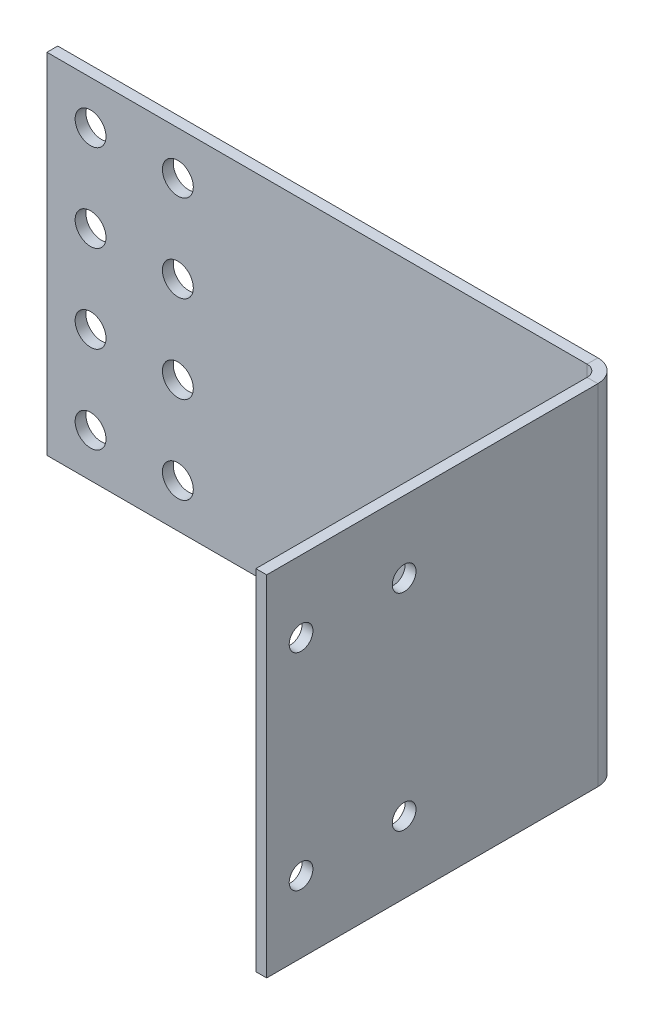
ISO-10303-21;
HEADER;
FILE_DESCRIPTION(('STEP AP214'),'2;1');
FILE_NAME('part.step','',(''),(''),'','','');
FILE_SCHEMA(('AUTOMOTIVE_DESIGN { 1 0 10303 214 1 1 1 1 }'));
ENDSEC;
DATA;
#1=APPLICATION_CONTEXT('core data for automotive mechanical design processes');
#2=APPLICATION_PROTOCOL_DEFINITION('international standard','automotive_design',2000,#1);
#3=PRODUCT_CONTEXT('',#1,'mechanical');
#4=PRODUCT('Part','Part','',(#3));
#5=PRODUCT_RELATED_PRODUCT_CATEGORY('part','',(#4));
#6=PRODUCT_DEFINITION_FORMATION('','',#4);
#7=PRODUCT_DEFINITION_CONTEXT('part definition',#1,'design');
#8=PRODUCT_DEFINITION('design','',#6,#7);
#9=PRODUCT_DEFINITION_SHAPE('','',#8);
#10=(LENGTH_UNIT() NAMED_UNIT(*) SI_UNIT(.MILLI.,.METRE.));
#11=(NAMED_UNIT(*) PLANE_ANGLE_UNIT() SI_UNIT($,.RADIAN.));
#12=(NAMED_UNIT(*) SI_UNIT($,.STERADIAN.) SOLID_ANGLE_UNIT());
#13=UNCERTAINTY_MEASURE_WITH_UNIT(LENGTH_MEASURE(1.E-05),#10,'distance_accuracy_value','');
#14=(GEOMETRIC_REPRESENTATION_CONTEXT(3) GLOBAL_UNCERTAINTY_ASSIGNED_CONTEXT((#13)) GLOBAL_UNIT_ASSIGNED_CONTEXT((#10,
#11,#12)) REPRESENTATION_CONTEXT('',''));
#15=CARTESIAN_POINT('',(0.,0.,0.));
#16=DIRECTION('',(0.,0.,1.));
#17=DIRECTION('',(1.,0.,0.));
#18=AXIS2_PLACEMENT_3D('',#15,#16,#17);
#19=CARTESIAN_POINT('',(69.1398205077934,0.,-67.8349794922068));
#20=DIRECTION('',(-1.,0.,0.));
#21=DIRECTION('',(0.,0.,1.));
#22=AXIS2_PLACEMENT_3D('',#19,#20,#21);
#23=PLANE('',#22);
#24=CARTESIAN_POINT('',(69.1398205077931,15.,29.8650205077932));
#25=DIRECTION('',(-1.,0.,0.));
#26=DIRECTION('',(0.,0.,1.));
#27=AXIS2_PLACEMENT_3D('',#24,#25,#26);
#28=CIRCLE('',#27,1.725);
#29=CARTESIAN_POINT('',(69.1398205077931,15.,31.5900205077932));
#30=VERTEX_POINT('',#29);
#31=EDGE_CURVE('E227',#30,#30,#28,.T.);
#32=ORIENTED_EDGE('',*,*,#31,.T.);
#33=EDGE_LOOP('',(#32));
#34=FACE_BOUND('',#33,.T.);
#35=CARTESIAN_POINT('',(69.1398205077931,15.,44.8650205077932));
#36=DIRECTION('',(-1.,0.,0.));
#37=DIRECTION('',(0.,0.,1.));
#38=AXIS2_PLACEMENT_3D('',#35,#36,#37);
#39=CIRCLE('',#38,1.725);
#40=CARTESIAN_POINT('',(69.1398205077931,15.,46.5900205077932));
#41=VERTEX_POINT('',#40);
#42=EDGE_CURVE('E221',#41,#41,#39,.T.);
#43=ORIENTED_EDGE('',*,*,#42,.T.);
#44=EDGE_LOOP('',(#43));
#45=FACE_BOUND('',#44,.T.);
#46=CARTESIAN_POINT('',(69.1398205077931,-15.,44.8650205077932));
#47=DIRECTION('',(-1.,0.,0.));
#48=DIRECTION('',(0.,0.,1.));
#49=AXIS2_PLACEMENT_3D('',#46,#47,#48);
#50=CIRCLE('',#49,1.725);
#51=CARTESIAN_POINT('',(69.1398205077931,-15.,46.5900205077932));
#52=VERTEX_POINT('',#51);
#53=EDGE_CURVE('E215',#52,#52,#50,.T.);
#54=ORIENTED_EDGE('',*,*,#53,.T.);
#55=EDGE_LOOP('',(#54));
#56=FACE_BOUND('',#55,.T.);
#57=CARTESIAN_POINT('',(69.1398205077931,-15.,29.8650205077932));
#58=DIRECTION('',(-1.,0.,0.));
#59=DIRECTION('',(0.,0.,1.));
#60=AXIS2_PLACEMENT_3D('',#57,#58,#59);
#61=CIRCLE('',#60,1.725);
#62=CARTESIAN_POINT('',(69.1398205077931,-15.,31.5900205077932));
#63=VERTEX_POINT('',#62);
#64=EDGE_CURVE('E207',#63,#63,#61,.T.);
#65=ORIENTED_EDGE('',*,*,#64,.T.);
#66=EDGE_LOOP('',(#65));
#67=FACE_BOUND('',#66,.T.);
#68=DIRECTION('',(0.,0.,1.));
#69=VECTOR('',#68,1.);
#70=CARTESIAN_POINT('',(69.1398205077935,-25.4,-80.5349794922068));
#71=LINE('',#70,#69);
#72=CARTESIAN_POINT('',(69.1398205077932,-25.4,1.67640000000001));
#73=VERTEX_POINT('',#72);
#74=CARTESIAN_POINT('',(69.139820507793,-25.4,49.8650205077932));
#75=VERTEX_POINT('',#74);
#76=EDGE_CURVE('E51',#73,#75,#71,.T.);
#77=ORIENTED_EDGE('',*,*,#76,.F.);
#78=DIRECTION('',(0.,1.,0.));
#79=VECTOR('',#78,1.);
#80=CARTESIAN_POINT('',(69.1398205077932,0.,1.67640000000001));
#81=LINE('',#80,#79);
#82=CARTESIAN_POINT('',(69.1398205077932,25.4,1.67640000000001));
#83=VERTEX_POINT('',#82);
#84=EDGE_CURVE('E136',#73,#83,#81,.T.);
#85=ORIENTED_EDGE('',*,*,#84,.T.);
#86=DIRECTION('',(0.,0.,-1.));
#87=VECTOR('',#86,1.);
#88=CARTESIAN_POINT('',(69.1398205077934,25.4,-55.1349794922068));
#89=LINE('',#88,#87);
#90=CARTESIAN_POINT('',(69.139820507793,25.4,49.8650205077932));
#91=VERTEX_POINT('',#90);
#92=EDGE_CURVE('E235',#91,#83,#89,.T.);
#93=ORIENTED_EDGE('',*,*,#92,.F.);
#94=DIRECTION('',(0.,1.,0.));
#95=VECTOR('',#94,1.);
#96=CARTESIAN_POINT('',(69.139820507793,25.4,49.8650205077932));
#97=LINE('',#96,#95);
#98=EDGE_CURVE('E232',#75,#91,#97,.T.);
#99=ORIENTED_EDGE('',*,*,#98,.F.);
#100=EDGE_LOOP('',(#77,#85,#93,#99));
#101=FACE_BOUND('',#100,.T.);
#102=ADVANCED_FACE('F47',(#34,#45,#56,#67,#101),#23,.F.);
#103=CARTESIAN_POINT('',(69.1398205077935,25.4,-80.5349794922068));
#104=DIRECTION('',(0.,1.,0.));
#105=DIRECTION('',(-1.,0.,0.));
#106=AXIS2_PLACEMENT_3D('',#103,#104,#105);
#107=PLANE('',#106);
#108=DIRECTION('',(1.,0.,0.));
#109=VECTOR('',#108,1.);
#110=CARTESIAN_POINT('',(69.1398205077932,25.4,1.67640000000001));
#111=LINE('',#110,#109);
#112=CARTESIAN_POINT('',(67.5650205077932,25.4,1.67640000000001));
#113=VERTEX_POINT('',#112);
#114=EDGE_CURVE('E12',#113,#83,#111,.T.);
#115=ORIENTED_EDGE('',*,*,#114,.F.);
#116=DIRECTION('',(0.,0.,-1.));
#117=VECTOR('',#116,1.);
#118=CARTESIAN_POINT('',(67.5650205077935,25.4,-80.5349794922068));
#119=LINE('',#118,#117);
#120=CARTESIAN_POINT('',(67.565020507793,25.4,49.8650205077932));
#121=VERTEX_POINT('',#120);
#122=EDGE_CURVE('E64',#121,#113,#119,.T.);
#123=ORIENTED_EDGE('',*,*,#122,.F.);
#124=DIRECTION('',(-1.,0.,0.));
#125=VECTOR('',#124,1.);
#126=CARTESIAN_POINT('',(69.139820507793,25.4,49.8650205077932));
#127=LINE('',#126,#125);
#128=EDGE_CURVE('E238',#91,#121,#127,.T.);
#129=ORIENTED_EDGE('',*,*,#128,.F.);
#130=ORIENTED_EDGE('',*,*,#92,.T.);
#131=EDGE_LOOP('',(#115,#123,#129,#130));
#132=FACE_BOUND('',#131,.T.);
#133=ADVANCED_FACE('F49',(#132),#107,.T.);
#134=CARTESIAN_POINT('',(69.139820507793,25.4,49.8650205077932));
#135=DIRECTION('',(0.,0.,1.));
#136=DIRECTION('',(1.,0.,0.));
#137=AXIS2_PLACEMENT_3D('',#134,#135,#136);
#138=PLANE('',#137);
#139=DIRECTION('',(0.,1.,0.));
#140=VECTOR('',#139,1.);
#141=CARTESIAN_POINT('',(67.565020507793,25.4,49.8650205077932));
#142=LINE('',#141,#140);
#143=CARTESIAN_POINT('',(67.565020507793,-25.4,49.8650205077932));
#144=VERTEX_POINT('',#143);
#145=EDGE_CURVE('E236',#144,#121,#142,.T.);
#146=ORIENTED_EDGE('',*,*,#145,.F.);
#147=DIRECTION('',(-1.,0.,0.));
#148=VECTOR('',#147,1.);
#149=CARTESIAN_POINT('',(69.139820507793,-25.4,49.8650205077932));
#150=LINE('',#149,#148);
#151=EDGE_CURVE('E241',#75,#144,#150,.T.);
#152=ORIENTED_EDGE('',*,*,#151,.F.);
#153=ORIENTED_EDGE('',*,*,#98,.T.);
#154=ORIENTED_EDGE('',*,*,#128,.T.);
#155=EDGE_LOOP('',(#146,#152,#153,#154));
#156=FACE_BOUND('',#155,.T.);
#157=ADVANCED_FACE('F256',(#156),#138,.T.);
#158=CARTESIAN_POINT('',(69.139820507793,-25.4,49.8650205077932));
#159=DIRECTION('',(0.,-1.,0.));
#160=DIRECTION('',(1.,0.,0.));
#161=AXIS2_PLACEMENT_3D('',#158,#159,#160);
#162=PLANE('',#161);
#163=DIRECTION('',(-1.,0.,0.));
#164=VECTOR('',#163,1.);
#165=CARTESIAN_POINT('',(69.1398205077932,-25.4,1.67640000000001));
#166=LINE('',#165,#164);
#167=CARTESIAN_POINT('',(67.5650205077932,-25.4,1.67640000000001));
#168=VERTEX_POINT('',#167);
#169=EDGE_CURVE('E244',#73,#168,#166,.T.);
#170=ORIENTED_EDGE('',*,*,#169,.F.);
#171=ORIENTED_EDGE('',*,*,#76,.T.);
#172=ORIENTED_EDGE('',*,*,#151,.T.);
#173=DIRECTION('',(0.,0.,1.));
#174=VECTOR('',#173,1.);
#175=CARTESIAN_POINT('',(67.565020507793,-25.4,49.8650205077932));
#176=LINE('',#175,#174);
#177=EDGE_CURVE('E72',#168,#144,#176,.T.);
#178=ORIENTED_EDGE('',*,*,#177,.F.);
#179=EDGE_LOOP('',(#170,#171,#172,#178));
#180=FACE_BOUND('',#179,.T.);
#181=ADVANCED_FACE('F253',(#180),#162,.T.);
#182=CARTESIAN_POINT('',(67.5650205077934,0.,-67.8349794922068));
#183=DIRECTION('',(-1.,0.,0.));
#184=DIRECTION('',(0.,0.,1.));
#185=AXIS2_PLACEMENT_3D('',#182,#183,#184);
#186=PLANE('',#185);
#187=DIRECTION('',(0.,1.,0.));
#188=VECTOR('',#187,1.);
#189=CARTESIAN_POINT('',(67.5650205077932,0.,1.67640000000001));
#190=LINE('',#189,#188);
#191=EDGE_CURVE('E56',#168,#113,#190,.T.);
#192=ORIENTED_EDGE('',*,*,#191,.F.);
#193=ORIENTED_EDGE('',*,*,#177,.T.);
#194=ORIENTED_EDGE('',*,*,#145,.T.);
#195=ORIENTED_EDGE('',*,*,#122,.T.);
#196=EDGE_LOOP('',(#192,#193,#194,#195));
#197=FACE_BOUND('',#196,.T.);
#198=CARTESIAN_POINT('',(67.5650205077931,-15.,29.8650205077932));
#199=DIRECTION('',(-1.,0.,0.));
#200=DIRECTION('',(0.,0.,1.));
#201=AXIS2_PLACEMENT_3D('',#198,#199,#200);
#202=CIRCLE('',#201,1.725);
#203=CARTESIAN_POINT('',(67.5650205077931,-15.,31.5900205077932));
#204=VERTEX_POINT('',#203);
#205=EDGE_CURVE('E211',#204,#204,#202,.T.);
#206=ORIENTED_EDGE('',*,*,#205,.F.);
#207=EDGE_LOOP('',(#206));
#208=FACE_BOUND('',#207,.T.);
#209=CARTESIAN_POINT('',(67.5650205077931,-15.,44.8650205077932));
#210=DIRECTION('',(-1.,0.,0.));
#211=DIRECTION('',(0.,0.,1.));
#212=AXIS2_PLACEMENT_3D('',#209,#210,#211);
#213=CIRCLE('',#212,1.725);
#214=CARTESIAN_POINT('',(67.5650205077931,-15.,46.5900205077932));
#215=VERTEX_POINT('',#214);
#216=EDGE_CURVE('E210',#215,#215,#213,.T.);
#217=ORIENTED_EDGE('',*,*,#216,.F.);
#218=EDGE_LOOP('',(#217));
#219=FACE_BOUND('',#218,.T.);
#220=CARTESIAN_POINT('',(67.5650205077931,15.,44.8650205077932));
#221=DIRECTION('',(-1.,0.,0.));
#222=DIRECTION('',(0.,0.,1.));
#223=AXIS2_PLACEMENT_3D('',#220,#221,#222);
#224=CIRCLE('',#223,1.725);
#225=CARTESIAN_POINT('',(67.5650205077931,15.,46.5900205077932));
#226=VERTEX_POINT('',#225);
#227=EDGE_CURVE('E218',#226,#226,#224,.T.);
#228=ORIENTED_EDGE('',*,*,#227,.F.);
#229=EDGE_LOOP('',(#228));
#230=FACE_BOUND('',#229,.T.);
#231=CARTESIAN_POINT('',(67.5650205077931,15.,29.8650205077932));
#232=DIRECTION('',(-1.,0.,0.));
#233=DIRECTION('',(0.,0.,1.));
#234=AXIS2_PLACEMENT_3D('',#231,#232,#233);
#235=CIRCLE('',#234,1.725);
#236=CARTESIAN_POINT('',(67.5650205077931,15.,31.5900205077932));
#237=VERTEX_POINT('',#236);
#238=EDGE_CURVE('E224',#237,#237,#235,.T.);
#239=ORIENTED_EDGE('',*,*,#238,.F.);
#240=EDGE_LOOP('',(#239));
#241=FACE_BOUND('',#240,.T.);
#242=ADVANCED_FACE('F249',(#197,#208,#219,#230,#241),#186,.T.);
#243=CARTESIAN_POINT('',(69.1398205077931,15.,29.8650205077932));
#244=DIRECTION('',(-1.,0.,0.));
#245=DIRECTION('',(0.,0.,1.));
#246=AXIS2_PLACEMENT_3D('',#243,#244,#245);
#247=CYLINDRICAL_SURFACE('',#246,1.725);
#248=ORIENTED_EDGE('',*,*,#31,.F.);
#249=EDGE_LOOP('',(#248));
#250=FACE_BOUND('',#249,.T.);
#251=ORIENTED_EDGE('',*,*,#238,.T.);
#252=EDGE_LOOP('',(#251));
#253=FACE_BOUND('',#252,.T.);
#254=ADVANCED_FACE('F311',(#250,#253),#247,.F.);
#255=CARTESIAN_POINT('',(69.1398205077931,15.,44.8650205077932));
#256=DIRECTION('',(-1.,0.,0.));
#257=DIRECTION('',(0.,0.,1.));
#258=AXIS2_PLACEMENT_3D('',#255,#256,#257);
#259=CYLINDRICAL_SURFACE('',#258,1.725);
#260=ORIENTED_EDGE('',*,*,#42,.F.);
#261=EDGE_LOOP('',(#260));
#262=FACE_BOUND('',#261,.T.);
#263=ORIENTED_EDGE('',*,*,#227,.T.);
#264=EDGE_LOOP('',(#263));
#265=FACE_BOUND('',#264,.T.);
#266=ADVANCED_FACE('F315',(#262,#265),#259,.F.);
#267=CARTESIAN_POINT('',(69.1398205077931,-15.,44.8650205077932));
#268=DIRECTION('',(-1.,0.,0.));
#269=DIRECTION('',(0.,0.,1.));
#270=AXIS2_PLACEMENT_3D('',#267,#268,#269);
#271=CYLINDRICAL_SURFACE('',#270,1.725);
#272=ORIENTED_EDGE('',*,*,#53,.F.);
#273=EDGE_LOOP('',(#272));
#274=FACE_BOUND('',#273,.T.);
#275=ORIENTED_EDGE('',*,*,#216,.T.);
#276=EDGE_LOOP('',(#275));
#277=FACE_BOUND('',#276,.T.);
#278=ADVANCED_FACE('F320',(#274,#277),#271,.F.);
#279=CARTESIAN_POINT('',(69.1398205077931,-15.,29.8650205077932));
#280=DIRECTION('',(-1.,0.,0.));
#281=DIRECTION('',(0.,0.,1.));
#282=AXIS2_PLACEMENT_3D('',#279,#280,#281);
#283=CYLINDRICAL_SURFACE('',#282,1.725);
#284=ORIENTED_EDGE('',*,*,#64,.F.);
#285=EDGE_LOOP('',(#284));
#286=FACE_BOUND('',#285,.T.);
#287=ORIENTED_EDGE('',*,*,#205,.T.);
#288=EDGE_LOOP('',(#287));
#289=FACE_BOUND('',#288,.T.);
#290=ADVANCED_FACE('F328',(#286,#289),#283,.F.);
#291=CARTESIAN_POINT('',(-6.35000000000001,19.05,-1.5748));
#292=DIRECTION('',(0.,0.,1.));
#293=DIRECTION('',(1.,0.,0.));
#294=AXIS2_PLACEMENT_3D('',#291,#292,#293);
#295=CYLINDRICAL_SURFACE('',#294,2.2479);
#296=CARTESIAN_POINT('',(-6.35000000000001,19.05,-1.5748));
#297=DIRECTION('',(0.,0.,1.));
#298=DIRECTION('',(1.,0.,0.));
#299=AXIS2_PLACEMENT_3D('',#296,#297,#298);
#300=CIRCLE('',#299,2.2479);
#301=CARTESIAN_POINT('',(-4.10210000000001,19.05,-1.5748));
#302=VERTEX_POINT('',#301);
#303=EDGE_CURVE('E154',#302,#302,#300,.T.);
#304=ORIENTED_EDGE('',*,*,#303,.F.);
#305=EDGE_LOOP('',(#304));
#306=FACE_BOUND('',#305,.T.);
#307=CARTESIAN_POINT('',(-6.35000000000001,19.05,0.));
#308=DIRECTION('',(0.,0.,1.));
#309=DIRECTION('',(1.,0.,0.));
#310=AXIS2_PLACEMENT_3D('',#307,#308,#309);
#311=CIRCLE('',#310,2.2479);
#312=CARTESIAN_POINT('',(-4.10210000000001,19.05,0.));
#313=VERTEX_POINT('',#312);
#314=EDGE_CURVE('E149',#313,#313,#311,.T.);
#315=ORIENTED_EDGE('',*,*,#314,.T.);
#316=EDGE_LOOP('',(#315));
#317=FACE_BOUND('',#316,.T.);
#318=ADVANCED_FACE('F332',(#306,#317),#295,.F.);
#319=CARTESIAN_POINT('',(6.34999999999968,19.05,-1.5748));
#320=DIRECTION('',(0.,0.,1.));
#321=DIRECTION('',(1.,0.,0.));
#322=AXIS2_PLACEMENT_3D('',#319,#320,#321);
#323=CYLINDRICAL_SURFACE('',#322,2.2479);
#324=CARTESIAN_POINT('',(6.34999999999968,19.05,-1.5748));
#325=DIRECTION('',(0.,0.,1.));
#326=DIRECTION('',(1.,0.,0.));
#327=AXIS2_PLACEMENT_3D('',#324,#325,#326);
#328=CIRCLE('',#327,2.2479);
#329=CARTESIAN_POINT('',(8.59789999999968,19.05,-1.5748));
#330=VERTEX_POINT('',#329);
#331=EDGE_CURVE('E157',#330,#330,#328,.T.);
#332=ORIENTED_EDGE('',*,*,#331,.F.);
#333=EDGE_LOOP('',(#332));
#334=FACE_BOUND('',#333,.T.);
#335=CARTESIAN_POINT('',(6.34999999999968,19.05,0.));
#336=DIRECTION('',(0.,0.,1.));
#337=DIRECTION('',(1.,0.,0.));
#338=AXIS2_PLACEMENT_3D('',#335,#336,#337);
#339=CIRCLE('',#338,2.2479);
#340=CARTESIAN_POINT('',(8.59789999999968,19.05,0.));
#341=VERTEX_POINT('',#340);
#342=EDGE_CURVE('E202',#341,#341,#339,.T.);
#343=ORIENTED_EDGE('',*,*,#342,.T.);
#344=EDGE_LOOP('',(#343));
#345=FACE_BOUND('',#344,.T.);
#346=ADVANCED_FACE('F368',(#334,#345),#323,.F.);
#347=CARTESIAN_POINT('',(6.34999999999968,6.35000000000017,-1.5748));
#348=DIRECTION('',(0.,0.,1.));
#349=DIRECTION('',(1.,0.,0.));
#350=AXIS2_PLACEMENT_3D('',#347,#348,#349);
#351=CYLINDRICAL_SURFACE('',#350,2.2479);
#352=CARTESIAN_POINT('',(6.34999999999968,6.35000000000017,-1.5748));
#353=DIRECTION('',(0.,0.,1.));
#354=DIRECTION('',(1.,0.,0.));
#355=AXIS2_PLACEMENT_3D('',#352,#353,#354);
#356=CIRCLE('',#355,2.2479);
#357=CARTESIAN_POINT('',(8.59789999999968,6.35000000000017,-1.5748));
#358=VERTEX_POINT('',#357);
#359=EDGE_CURVE('E163',#358,#358,#356,.T.);
#360=ORIENTED_EDGE('',*,*,#359,.F.);
#361=EDGE_LOOP('',(#360));
#362=FACE_BOUND('',#361,.T.);
#363=CARTESIAN_POINT('',(6.34999999999968,6.35000000000017,0.));
#364=DIRECTION('',(0.,0.,1.));
#365=DIRECTION('',(1.,0.,0.));
#366=AXIS2_PLACEMENT_3D('',#363,#364,#365);
#367=CIRCLE('',#366,2.2479);
#368=CARTESIAN_POINT('',(8.59789999999968,6.35000000000017,0.));
#369=VERTEX_POINT('',#368);
#370=EDGE_CURVE('E199',#369,#369,#367,.T.);
#371=ORIENTED_EDGE('',*,*,#370,.T.);
#372=EDGE_LOOP('',(#371));
#373=FACE_BOUND('',#372,.T.);
#374=ADVANCED_FACE('F364',(#362,#373),#351,.F.);
#375=CARTESIAN_POINT('',(6.34999999999968,-6.34999999999982,-1.5748));
#376=DIRECTION('',(0.,0.,1.));
#377=DIRECTION('',(1.,0.,0.));
#378=AXIS2_PLACEMENT_3D('',#375,#376,#377);
#379=CYLINDRICAL_SURFACE('',#378,2.2479);
#380=CARTESIAN_POINT('',(6.34999999999968,-6.34999999999982,-1.5748));
#381=DIRECTION('',(0.,0.,1.));
#382=DIRECTION('',(1.,0.,0.));
#383=AXIS2_PLACEMENT_3D('',#380,#381,#382);
#384=CIRCLE('',#383,2.2479);
#385=CARTESIAN_POINT('',(8.59789999999968,-6.34999999999982,-1.5748));
#386=VERTEX_POINT('',#385);
#387=EDGE_CURVE('E166',#386,#386,#384,.T.);
#388=ORIENTED_EDGE('',*,*,#387,.F.);
#389=EDGE_LOOP('',(#388));
#390=FACE_BOUND('',#389,.T.);
#391=CARTESIAN_POINT('',(6.34999999999968,-6.34999999999982,0.));
#392=DIRECTION('',(0.,0.,1.));
#393=DIRECTION('',(1.,0.,0.));
#394=AXIS2_PLACEMENT_3D('',#391,#392,#393);
#395=CIRCLE('',#394,2.2479);
#396=CARTESIAN_POINT('',(8.59789999999968,-6.34999999999982,0.));
#397=VERTEX_POINT('',#396);
#398=EDGE_CURVE('E196',#397,#397,#395,.T.);
#399=ORIENTED_EDGE('',*,*,#398,.T.);
#400=EDGE_LOOP('',(#399));
#401=FACE_BOUND('',#400,.T.);
#402=ADVANCED_FACE('F360',(#390,#401),#379,.F.);
#403=CARTESIAN_POINT('',(6.34999999999968,-19.0499999999998,-1.5748));
#404=DIRECTION('',(0.,0.,1.));
#405=DIRECTION('',(1.,0.,0.));
#406=AXIS2_PLACEMENT_3D('',#403,#404,#405);
#407=CYLINDRICAL_SURFACE('',#406,2.2479);
#408=CARTESIAN_POINT('',(6.34999999999968,-19.0499999999998,-1.5748));
#409=DIRECTION('',(0.,0.,1.));
#410=DIRECTION('',(1.,0.,0.));
#411=AXIS2_PLACEMENT_3D('',#408,#409,#410);
#412=CIRCLE('',#411,2.2479);
#413=CARTESIAN_POINT('',(8.59789999999968,-19.0499999999998,-1.5748));
#414=VERTEX_POINT('',#413);
#415=EDGE_CURVE('E169',#414,#414,#412,.T.);
#416=ORIENTED_EDGE('',*,*,#415,.F.);
#417=EDGE_LOOP('',(#416));
#418=FACE_BOUND('',#417,.T.);
#419=CARTESIAN_POINT('',(6.34999999999968,-19.0499999999998,0.));
#420=DIRECTION('',(0.,0.,1.));
#421=DIRECTION('',(1.,0.,0.));
#422=AXIS2_PLACEMENT_3D('',#419,#420,#421);
#423=CIRCLE('',#422,2.2479);
#424=CARTESIAN_POINT('',(8.59789999999968,-19.0499999999998,0.));
#425=VERTEX_POINT('',#424);
#426=EDGE_CURVE('E193',#425,#425,#423,.T.);
#427=ORIENTED_EDGE('',*,*,#426,.T.);
#428=EDGE_LOOP('',(#427));
#429=FACE_BOUND('',#428,.T.);
#430=ADVANCED_FACE('F356',(#418,#429),#407,.F.);
#431=CARTESIAN_POINT('',(-6.35000000000001,6.35,-1.5748));
#432=DIRECTION('',(0.,0.,1.));
#433=DIRECTION('',(1.,0.,0.));
#434=AXIS2_PLACEMENT_3D('',#431,#432,#433);
#435=CYLINDRICAL_SURFACE('',#434,2.2479);
#436=CARTESIAN_POINT('',(-6.35000000000001,6.35,-1.5748));
#437=DIRECTION('',(0.,0.,1.));
#438=DIRECTION('',(1.,0.,0.));
#439=AXIS2_PLACEMENT_3D('',#436,#437,#438);
#440=CIRCLE('',#439,2.2479);
#441=CARTESIAN_POINT('',(-4.10210000000001,6.35,-1.5748));
#442=VERTEX_POINT('',#441);
#443=EDGE_CURVE('E172',#442,#442,#440,.T.);
#444=ORIENTED_EDGE('',*,*,#443,.F.);
#445=EDGE_LOOP('',(#444));
#446=FACE_BOUND('',#445,.T.);
#447=CARTESIAN_POINT('',(-6.35000000000001,6.35,0.));
#448=DIRECTION('',(0.,0.,1.));
#449=DIRECTION('',(1.,0.,0.));
#450=AXIS2_PLACEMENT_3D('',#447,#448,#449);
#451=CIRCLE('',#450,2.2479);
#452=CARTESIAN_POINT('',(-4.10210000000001,6.35,0.));
#453=VERTEX_POINT('',#452);
#454=EDGE_CURVE('E190',#453,#453,#451,.T.);
#455=ORIENTED_EDGE('',*,*,#454,.T.);
#456=EDGE_LOOP('',(#455));
#457=FACE_BOUND('',#456,.T.);
#458=ADVANCED_FACE('F352',(#446,#457),#435,.F.);
#459=CARTESIAN_POINT('',(-6.35,-6.35,-1.5748));
#460=DIRECTION('',(0.,0.,1.));
#461=DIRECTION('',(1.,0.,0.));
#462=AXIS2_PLACEMENT_3D('',#459,#460,#461);
#463=CYLINDRICAL_SURFACE('',#462,2.2479);
#464=CARTESIAN_POINT('',(-6.35,-6.35,-1.5748));
#465=DIRECTION('',(0.,0.,1.));
#466=DIRECTION('',(1.,0.,0.));
#467=AXIS2_PLACEMENT_3D('',#464,#465,#466);
#468=CIRCLE('',#467,2.2479);
#469=CARTESIAN_POINT('',(-4.10210000000001,-6.35,-1.5748));
#470=VERTEX_POINT('',#469);
#471=EDGE_CURVE('E175',#470,#470,#468,.T.);
#472=ORIENTED_EDGE('',*,*,#471,.F.);
#473=EDGE_LOOP('',(#472));
#474=FACE_BOUND('',#473,.T.);
#475=CARTESIAN_POINT('',(-6.35,-6.35,0.));
#476=DIRECTION('',(0.,0.,1.));
#477=DIRECTION('',(1.,0.,0.));
#478=AXIS2_PLACEMENT_3D('',#475,#476,#477);
#479=CIRCLE('',#478,2.2479);
#480=CARTESIAN_POINT('',(-4.10210000000001,-6.35,0.));
#481=VERTEX_POINT('',#480);
#482=EDGE_CURVE('E187',#481,#481,#479,.T.);
#483=ORIENTED_EDGE('',*,*,#482,.T.);
#484=EDGE_LOOP('',(#483));
#485=FACE_BOUND('',#484,.T.);
#486=ADVANCED_FACE('F348',(#474,#485),#463,.F.);
#487=CARTESIAN_POINT('',(-6.35,-19.05,-1.5748));
#488=DIRECTION('',(0.,0.,1.));
#489=DIRECTION('',(1.,0.,0.));
#490=AXIS2_PLACEMENT_3D('',#487,#488,#489);
#491=CYLINDRICAL_SURFACE('',#490,2.2479);
#492=CARTESIAN_POINT('',(-6.35,-19.05,-1.5748));
#493=DIRECTION('',(0.,0.,1.));
#494=DIRECTION('',(1.,0.,0.));
#495=AXIS2_PLACEMENT_3D('',#492,#493,#494);
#496=CIRCLE('',#495,2.2479);
#497=CARTESIAN_POINT('',(-4.1021,-19.05,-1.5748));
#498=VERTEX_POINT('',#497);
#499=EDGE_CURVE('E178',#498,#498,#496,.T.);
#500=ORIENTED_EDGE('',*,*,#499,.F.);
#501=EDGE_LOOP('',(#500));
#502=FACE_BOUND('',#501,.T.);
#503=CARTESIAN_POINT('',(-6.35,-19.05,0.));
#504=DIRECTION('',(0.,0.,1.));
#505=DIRECTION('',(1.,0.,0.));
#506=AXIS2_PLACEMENT_3D('',#503,#504,#505);
#507=CIRCLE('',#506,2.2479);
#508=CARTESIAN_POINT('',(-4.1021,-19.05,0.));
#509=VERTEX_POINT('',#508);
#510=EDGE_CURVE('E184',#509,#509,#507,.T.);
#511=ORIENTED_EDGE('',*,*,#510,.T.);
#512=EDGE_LOOP('',(#511));
#513=FACE_BOUND('',#512,.T.);
#514=ADVANCED_FACE('F345',(#502,#513),#491,.F.);
#515=CARTESIAN_POINT('',(-12.7,25.4,-1.5748));
#516=DIRECTION('',(-1.,0.,0.));
#517=DIRECTION('',(0.,0.,1.));
#518=AXIS2_PLACEMENT_3D('',#515,#516,#517);
#519=PLANE('',#518);
#520=DIRECTION('',(0.,-1.,0.));
#521=VECTOR('',#520,1.);
#522=CARTESIAN_POINT('',(-12.7,25.4,0.));
#523=LINE('',#522,#521);
#524=CARTESIAN_POINT('',(-12.7,25.4,0.));
#525=VERTEX_POINT('',#524);
#526=CARTESIAN_POINT('',(-12.7,-25.4,0.));
#527=VERTEX_POINT('',#526);
#528=EDGE_CURVE('E273',#525,#527,#523,.T.);
#529=ORIENTED_EDGE('',*,*,#528,.F.);
#530=DIRECTION('',(0.,0.,1.));
#531=VECTOR('',#530,1.);
#532=CARTESIAN_POINT('',(-12.7,25.4,-1.5748));
#533=LINE('',#532,#531);
#534=CARTESIAN_POINT('',(-12.7,25.4,-1.5748));
#535=VERTEX_POINT('',#534);
#536=EDGE_CURVE('E214',#535,#525,#533,.T.);
#537=ORIENTED_EDGE('',*,*,#536,.F.);
#538=DIRECTION('',(0.,-1.,0.));
#539=VECTOR('',#538,1.);
#540=CARTESIAN_POINT('',(-12.7,25.4,-1.5748));
#541=LINE('',#540,#539);
#542=CARTESIAN_POINT('',(-12.7,-25.4,-1.5748));
#543=VERTEX_POINT('',#542);
#544=EDGE_CURVE('E182',#535,#543,#541,.T.);
#545=ORIENTED_EDGE('',*,*,#544,.T.);
#546=DIRECTION('',(0.,0.,1.));
#547=VECTOR('',#546,1.);
#548=CARTESIAN_POINT('',(-12.7,-25.4,-1.5748));
#549=LINE('',#548,#547);
#550=EDGE_CURVE('E153',#543,#527,#549,.T.);
#551=ORIENTED_EDGE('',*,*,#550,.T.);
#552=EDGE_LOOP('',(#529,#537,#545,#551));
#553=FACE_BOUND('',#552,.T.);
#554=ADVANCED_FACE('F285',(#553),#519,.T.);
#555=CARTESIAN_POINT('',(0.,0.,-1.5748));
#556=DIRECTION('',(0.,0.,1.));
#557=DIRECTION('',(1.,0.,0.));
#558=AXIS2_PLACEMENT_3D('',#555,#556,#557);
#559=PLANE('',#558);
#560=DIRECTION('',(0.,1.,0.));
#561=VECTOR('',#560,1.);
#562=CARTESIAN_POINT('',(65.8886205077932,0.,-1.5748));
#563=LINE('',#562,#561);
#564=CARTESIAN_POINT('',(65.8886205077932,-25.4,-1.5748));
#565=VERTEX_POINT('',#564);
#566=CARTESIAN_POINT('',(65.8886205077932,25.4,-1.5748));
#567=VERTEX_POINT('',#566);
#568=EDGE_CURVE('E133',#565,#567,#563,.T.);
#569=ORIENTED_EDGE('',*,*,#568,.F.);
#570=DIRECTION('',(1.,0.,0.));
#571=VECTOR('',#570,1.);
#572=CARTESIAN_POINT('',(-12.7,-25.4,-1.5748));
#573=LINE('',#572,#571);
#574=EDGE_CURVE('E127',#543,#565,#573,.T.);
#575=ORIENTED_EDGE('',*,*,#574,.F.);
#576=ORIENTED_EDGE('',*,*,#544,.F.);
#577=DIRECTION('',(-1.,0.,0.));
#578=VECTOR('',#577,1.);
#579=CARTESIAN_POINT('',(12.7,25.4,-1.5748));
#580=LINE('',#579,#578);
#581=EDGE_CURVE('E147',#567,#535,#580,.T.);
#582=ORIENTED_EDGE('',*,*,#581,.F.);
#583=EDGE_LOOP('',(#569,#575,#576,#582));
#584=FACE_BOUND('',#583,.T.);
#585=ORIENTED_EDGE('',*,*,#499,.T.);
#586=EDGE_LOOP('',(#585));
#587=FACE_BOUND('',#586,.T.);
#588=ORIENTED_EDGE('',*,*,#471,.T.);
#589=EDGE_LOOP('',(#588));
#590=FACE_BOUND('',#589,.T.);
#591=ORIENTED_EDGE('',*,*,#443,.T.);
#592=EDGE_LOOP('',(#591));
#593=FACE_BOUND('',#592,.T.);
#594=ORIENTED_EDGE('',*,*,#415,.T.);
#595=EDGE_LOOP('',(#594));
#596=FACE_BOUND('',#595,.T.);
#597=ORIENTED_EDGE('',*,*,#387,.T.);
#598=EDGE_LOOP('',(#597));
#599=FACE_BOUND('',#598,.T.);
#600=ORIENTED_EDGE('',*,*,#359,.T.);
#601=EDGE_LOOP('',(#600));
#602=FACE_BOUND('',#601,.T.);
#603=ORIENTED_EDGE('',*,*,#331,.T.);
#604=EDGE_LOOP('',(#603));
#605=FACE_BOUND('',#604,.T.);
#606=ORIENTED_EDGE('',*,*,#303,.T.);
#607=EDGE_LOOP('',(#606));
#608=FACE_BOUND('',#607,.T.);
#609=ADVANCED_FACE('F143',(#584,#587,#590,#593,#596,#599,#602,#605,#608),#559,.F.);
#610=CARTESIAN_POINT('',(117.7,-25.4,-1.5748));
#611=DIRECTION('',(0.,-1.,0.));
#612=DIRECTION('',(0.,0.,-1.));
#613=AXIS2_PLACEMENT_3D('',#610,#611,#612);
#614=PLANE('',#613);
#615=ORIENTED_EDGE('',*,*,#574,.T.);
#616=DIRECTION('',(0.,0.,1.));
#617=VECTOR('',#616,1.);
#618=CARTESIAN_POINT('',(65.8886205077932,-25.4,-1.5748));
#619=LINE('',#618,#617);
#620=CARTESIAN_POINT('',(65.8886205077932,-25.4,0.));
#621=VERTEX_POINT('',#620);
#622=EDGE_CURVE('E115',#565,#621,#619,.T.);
#623=ORIENTED_EDGE('',*,*,#622,.T.);
#624=DIRECTION('',(1.,0.,0.));
#625=VECTOR('',#624,1.);
#626=CARTESIAN_POINT('',(117.7,-25.4,0.));
#627=LINE('',#626,#625);
#628=EDGE_CURVE('E126',#527,#621,#627,.T.);
#629=ORIENTED_EDGE('',*,*,#628,.F.);
#630=ORIENTED_EDGE('',*,*,#550,.F.);
#631=EDGE_LOOP('',(#615,#623,#629,#630));
#632=FACE_BOUND('',#631,.T.);
#633=ADVANCED_FACE('F151',(#632),#614,.T.);
#634=CARTESIAN_POINT('',(0.,0.,0.));
#635=DIRECTION('',(0.,0.,1.));
#636=DIRECTION('',(1.,0.,0.));
#637=AXIS2_PLACEMENT_3D('',#634,#635,#636);
#638=PLANE('',#637);
#639=ORIENTED_EDGE('',*,*,#314,.F.);
#640=EDGE_LOOP('',(#639));
#641=FACE_BOUND('',#640,.T.);
#642=ORIENTED_EDGE('',*,*,#342,.F.);
#643=EDGE_LOOP('',(#642));
#644=FACE_BOUND('',#643,.T.);
#645=ORIENTED_EDGE('',*,*,#370,.F.);
#646=EDGE_LOOP('',(#645));
#647=FACE_BOUND('',#646,.T.);
#648=ORIENTED_EDGE('',*,*,#398,.F.);
#649=EDGE_LOOP('',(#648));
#650=FACE_BOUND('',#649,.T.);
#651=ORIENTED_EDGE('',*,*,#426,.F.);
#652=EDGE_LOOP('',(#651));
#653=FACE_BOUND('',#652,.T.);
#654=ORIENTED_EDGE('',*,*,#454,.F.);
#655=EDGE_LOOP('',(#654));
#656=FACE_BOUND('',#655,.T.);
#657=ORIENTED_EDGE('',*,*,#482,.F.);
#658=EDGE_LOOP('',(#657));
#659=FACE_BOUND('',#658,.T.);
#660=ORIENTED_EDGE('',*,*,#510,.F.);
#661=EDGE_LOOP('',(#660));
#662=FACE_BOUND('',#661,.T.);
#663=ORIENTED_EDGE('',*,*,#628,.T.);
#664=DIRECTION('',(0.,1.,0.));
#665=VECTOR('',#664,1.);
#666=CARTESIAN_POINT('',(65.8886205077932,0.,0.));
#667=LINE('',#666,#665);
#668=CARTESIAN_POINT('',(65.8886205077932,25.4,0.));
#669=VERTEX_POINT('',#668);
#670=EDGE_CURVE('E278',#621,#669,#667,.T.);
#671=ORIENTED_EDGE('',*,*,#670,.T.);
#672=DIRECTION('',(-1.,0.,0.));
#673=VECTOR('',#672,1.);
#674=CARTESIAN_POINT('',(-12.7,25.4,0.));
#675=LINE('',#674,#673);
#676=EDGE_CURVE('E276',#669,#525,#675,.T.);
#677=ORIENTED_EDGE('',*,*,#676,.T.);
#678=ORIENTED_EDGE('',*,*,#528,.T.);
#679=EDGE_LOOP('',(#663,#671,#677,#678));
#680=FACE_BOUND('',#679,.T.);
#681=ADVANCED_FACE('F282',(#641,#644,#647,#650,#653,#656,#659,#662,#680),#638,.T.);
#682=CARTESIAN_POINT('',(-12.7,25.4,-1.5748));
#683=DIRECTION('',(0.,1.,0.));
#684=DIRECTION('',(0.,0.,1.));
#685=AXIS2_PLACEMENT_3D('',#682,#683,#684);
#686=PLANE('',#685);
#687=ORIENTED_EDGE('',*,*,#676,.F.);
#688=DIRECTION('',(0.,0.,-1.));
#689=VECTOR('',#688,1.);
#690=CARTESIAN_POINT('',(65.8886205077932,25.4,-1.5748));
#691=LINE('',#690,#689);
#692=EDGE_CURVE('E271',#669,#567,#691,.T.);
#693=ORIENTED_EDGE('',*,*,#692,.T.);
#694=ORIENTED_EDGE('',*,*,#581,.T.);
#695=ORIENTED_EDGE('',*,*,#536,.T.);
#696=EDGE_LOOP('',(#687,#693,#694,#695));
#697=FACE_BOUND('',#696,.T.);
#698=ADVANCED_FACE('F289',(#697),#686,.T.);
#699=CARTESIAN_POINT('',(65.8886205077932,-25.4,1.6764));
#700=DIRECTION('',(0.,-1.,0.));
#701=DIRECTION('',(0.,0.,-1.));
#702=AXIS2_PLACEMENT_3D('',#699,#700,#701);
#703=PLANE('',#702);
#704=ORIENTED_EDGE('',*,*,#169,.T.);
#705=CARTESIAN_POINT('',(65.8886205077932,-25.3999999999999,1.6764));
#706=DIRECTION('',(0.,-1.,0.));
#707=DIRECTION('',(0.,0.,-1.));
#708=AXIS2_PLACEMENT_3D('',#705,#706,#707);
#709=CIRCLE('',#708,1.6764);
#710=EDGE_CURVE('E122',#168,#621,#709,.F.);
#711=ORIENTED_EDGE('',*,*,#710,.T.);
#712=ORIENTED_EDGE('',*,*,#622,.F.);
#713=CARTESIAN_POINT('',(65.8886205077932,-25.4,1.6764));
#714=DIRECTION('',(0.,1.,0.));
#715=DIRECTION('',(0.,0.,-1.));
#716=AXIS2_PLACEMENT_3D('',#713,#714,#715);
#717=CIRCLE('',#716,3.2512);
#718=EDGE_CURVE('E119',#73,#565,#717,.T.);
#719=ORIENTED_EDGE('',*,*,#718,.F.);
#720=EDGE_LOOP('',(#704,#711,#712,#719));
#721=FACE_BOUND('',#720,.T.);
#722=ADVANCED_FACE('F118',(#721),#703,.T.);
#723=CARTESIAN_POINT('',(65.8886205077932,25.4,1.6764));
#724=DIRECTION('',(0.,1.,0.));
#725=DIRECTION('',(0.,0.,1.));
#726=AXIS2_PLACEMENT_3D('',#723,#724,#725);
#727=PLANE('',#726);
#728=ORIENTED_EDGE('',*,*,#692,.F.);
#729=CARTESIAN_POINT('',(65.8886205077932,25.4,1.6764));
#730=DIRECTION('',(0.,-1.,0.));
#731=DIRECTION('',(0.,0.,-1.));
#732=AXIS2_PLACEMENT_3D('',#729,#730,#731);
#733=CIRCLE('',#732,1.6764);
#734=EDGE_CURVE('E138',#669,#113,#733,.T.);
#735=ORIENTED_EDGE('',*,*,#734,.T.);
#736=ORIENTED_EDGE('',*,*,#114,.T.);
#737=CARTESIAN_POINT('',(65.8886205077932,25.4,1.6764));
#738=DIRECTION('',(0.,-1.,0.));
#739=DIRECTION('',(0.,0.,1.));
#740=AXIS2_PLACEMENT_3D('',#737,#738,#739);
#741=CIRCLE('',#740,3.2512);
#742=EDGE_CURVE('E137',#567,#83,#741,.T.);
#743=ORIENTED_EDGE('',*,*,#742,.F.);
#744=EDGE_LOOP('',(#728,#735,#736,#743));
#745=FACE_BOUND('',#744,.T.);
#746=ADVANCED_FACE('F262',(#745),#727,.T.);
#747=CARTESIAN_POINT('',(65.8886205077932,50.9533549209387,1.6764));
#748=DIRECTION('',(0.,-1.,0.));
#749=DIRECTION('',(0.,0.,-1.));
#750=AXIS2_PLACEMENT_3D('',#747,#748,#749);
#751=CYLINDRICAL_SURFACE('',#750,3.2512);
#752=ORIENTED_EDGE('',*,*,#742,.T.);
#753=ORIENTED_EDGE('',*,*,#84,.F.);
#754=ORIENTED_EDGE('',*,*,#718,.T.);
#755=ORIENTED_EDGE('',*,*,#568,.T.);
#756=EDGE_LOOP('',(#752,#753,#754,#755));
#757=FACE_BOUND('',#756,.T.);
#758=ADVANCED_FACE('F132',(#757),#751,.T.);
#759=CARTESIAN_POINT('',(65.8886205077932,50.9533549209387,1.6764));
#760=DIRECTION('',(0.,-1.,0.));
#761=DIRECTION('',(0.,0.,-1.));
#762=AXIS2_PLACEMENT_3D('',#759,#760,#761);
#763=CYLINDRICAL_SURFACE('',#762,1.6764);
#764=ORIENTED_EDGE('',*,*,#734,.F.);
#765=ORIENTED_EDGE('',*,*,#670,.F.);
#766=ORIENTED_EDGE('',*,*,#710,.F.);
#767=ORIENTED_EDGE('',*,*,#191,.T.);
#768=EDGE_LOOP('',(#764,#765,#766,#767));
#769=FACE_BOUND('',#768,.T.);
#770=ADVANCED_FACE('F291',(#769),#763,.F.);
#771=CLOSED_SHELL('',(#102,#133,#157,#181,#242,#254,#266,#278,#290,#318,#346,#374,#402,#430,
#458,#486,#514,#554,#609,#633,#681,#698,#722,#746,#758,#770));
#772=MANIFOLD_SOLID_BREP('B2',#771);
#773=ADVANCED_BREP_SHAPE_REPRESENTATION('',(#18,#772),#14);
#774=SHAPE_DEFINITION_REPRESENTATION(#9,#773);
ENDSEC;
END-ISO-10303-21;
